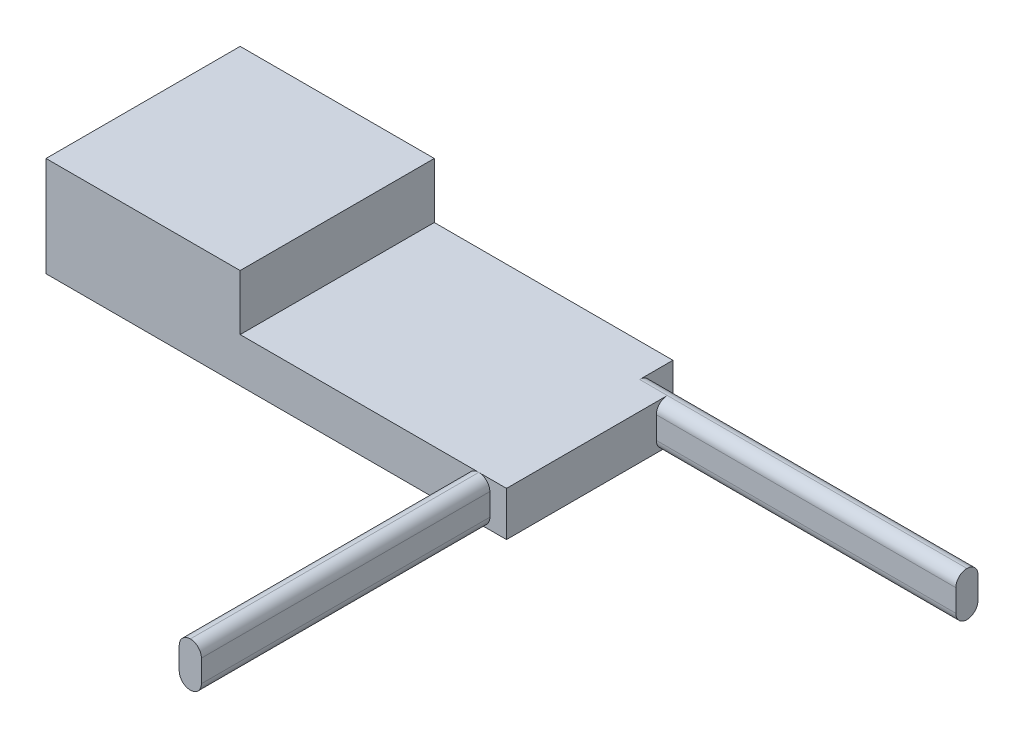
ISO-10303-21;
HEADER;
FILE_DESCRIPTION(('STEP AP214'),'2;1');
FILE_NAME('part.step','',(''),(''),'','','');
FILE_SCHEMA(('AUTOMOTIVE_DESIGN { 1 0 10303 214 1 1 1 1 }'));
ENDSEC;
DATA;
#1=APPLICATION_CONTEXT('core data for automotive mechanical design processes');
#2=APPLICATION_PROTOCOL_DEFINITION('international standard','automotive_design',2000,#1);
#3=PRODUCT_CONTEXT('',#1,'mechanical');
#4=PRODUCT('Part','Part','',(#3));
#5=PRODUCT_RELATED_PRODUCT_CATEGORY('part','',(#4));
#6=PRODUCT_DEFINITION_FORMATION('','',#4);
#7=PRODUCT_DEFINITION_CONTEXT('part definition',#1,'design');
#8=PRODUCT_DEFINITION('design','',#6,#7);
#9=PRODUCT_DEFINITION_SHAPE('','',#8);
#10=(LENGTH_UNIT() NAMED_UNIT(*) SI_UNIT(.MILLI.,.METRE.));
#11=(NAMED_UNIT(*) PLANE_ANGLE_UNIT() SI_UNIT($,.RADIAN.));
#12=(NAMED_UNIT(*) SI_UNIT($,.STERADIAN.) SOLID_ANGLE_UNIT());
#13=UNCERTAINTY_MEASURE_WITH_UNIT(LENGTH_MEASURE(1.E-05),#10,'distance_accuracy_value','');
#14=(GEOMETRIC_REPRESENTATION_CONTEXT(3) GLOBAL_UNCERTAINTY_ASSIGNED_CONTEXT((#13)) GLOBAL_UNIT_ASSIGNED_CONTEXT((#10,
#11,#12)) REPRESENTATION_CONTEXT('',''));
#15=CARTESIAN_POINT('',(0.,0.,0.));
#16=DIRECTION('',(0.,0.,1.));
#17=DIRECTION('',(1.,0.,0.));
#18=AXIS2_PLACEMENT_3D('',#15,#16,#17);
#19=CARTESIAN_POINT('',(0.,4.,0.));
#20=DIRECTION('',(0.,1.,0.));
#21=DIRECTION('',(0.,0.,1.));
#22=AXIS2_PLACEMENT_3D('',#19,#20,#21);
#23=PLANE('',#22);
#24=DIRECTION('',(-1.,0.,0.));
#25=VECTOR('',#24,1.);
#26=CARTESIAN_POINT('',(27.5,4.,-17.4999999999841));
#27=LINE('',#26,#25);
#28=CARTESIAN_POINT('',(27.5,4.,-17.4999999999841));
#29=VERTEX_POINT('',#28);
#30=CARTESIAN_POINT('',(5.99101541676987,4.,-17.4999999999841));
#31=VERTEX_POINT('',#30);
#32=EDGE_CURVE('E55',#29,#31,#27,.T.);
#33=ORIENTED_EDGE('',*,*,#32,.T.);
#34=DIRECTION('',(0.,0.,-1.));
#35=VECTOR('',#34,1.);
#36=CARTESIAN_POINT('',(5.99101541676987,4.,-17.4999999999841));
#37=LINE('',#36,#35);
#38=CARTESIAN_POINT('',(5.99101541676987,4.,0.));
#39=VERTEX_POINT('',#38);
#40=EDGE_CURVE('E50',#39,#31,#37,.T.);
#41=ORIENTED_EDGE('',*,*,#40,.F.);
#42=DIRECTION('',(1.,0.,0.));
#43=VECTOR('',#42,1.);
#44=CARTESIAN_POINT('',(-11.5089845832301,4.,0.));
#45=LINE('',#44,#43);
#46=CARTESIAN_POINT('',(27.5,4.,0.));
#47=VERTEX_POINT('',#46);
#48=EDGE_CURVE('E198',#39,#47,#45,.T.);
#49=ORIENTED_EDGE('',*,*,#48,.T.);
#50=DIRECTION('',(1.,0.,0.));
#51=VECTOR('',#50,1.);
#52=CARTESIAN_POINT('',(28.5,4.,0.));
#53=LINE('',#52,#51);
#54=CARTESIAN_POINT('',(30.,4.,0.));
#55=VERTEX_POINT('',#54);
#56=EDGE_CURVE('E200',#47,#55,#53,.T.);
#57=ORIENTED_EDGE('',*,*,#56,.T.);
#58=DIRECTION('',(0.,0.,-1.));
#59=VECTOR('',#58,1.);
#60=CARTESIAN_POINT('',(30.,4.,-13.5));
#61=LINE('',#60,#59);
#62=CARTESIAN_POINT('',(30.,4.,-14.5));
#63=VERTEX_POINT('',#62);
#64=EDGE_CURVE('E202',#55,#63,#61,.T.);
#65=ORIENTED_EDGE('',*,*,#64,.T.);
#66=DIRECTION('',(-1.,0.,0.));
#67=VECTOR('',#66,1.);
#68=CARTESIAN_POINT('',(27.5,4.,-14.5));
#69=LINE('',#68,#67);
#70=CARTESIAN_POINT('',(27.5,4.,-14.5));
#71=VERTEX_POINT('',#70);
#72=EDGE_CURVE('E289',#63,#71,#69,.T.);
#73=ORIENTED_EDGE('',*,*,#72,.T.);
#74=DIRECTION('',(0.,0.,-1.));
#75=VECTOR('',#74,1.);
#76=CARTESIAN_POINT('',(27.5,4.,-15.5));
#77=LINE('',#76,#75);
#78=EDGE_CURVE('E204',#71,#29,#77,.T.);
#79=ORIENTED_EDGE('',*,*,#78,.T.);
#80=EDGE_LOOP('',(#33,#41,#49,#57,#65,#73,#79));
#81=FACE_BOUND('',#80,.T.);
#82=ADVANCED_FACE('F33',(#81),#23,.T.);
#83=CARTESIAN_POINT('',(0.,4.,0.));
#84=DIRECTION('',(0.,0.,-1.));
#85=DIRECTION('',(-1.,0.,0.));
#86=AXIS2_PLACEMENT_3D('',#83,#84,#85);
#87=PLANE('',#86);
#88=DIRECTION('',(1.,0.,0.));
#89=VECTOR('',#88,1.);
#90=CARTESIAN_POINT('',(0.,0.,0.));
#91=LINE('',#90,#89);
#92=CARTESIAN_POINT('',(-11.5089845832301,0.,0.));
#93=VERTEX_POINT('',#92);
#94=CARTESIAN_POINT('',(27.5,0.,0.));
#95=VERTEX_POINT('',#94);
#96=EDGE_CURVE('E207',#93,#95,#91,.T.);
#97=ORIENTED_EDGE('',*,*,#96,.T.);
#98=CARTESIAN_POINT('',(27.5,1.,0.));
#99=DIRECTION('',(0.,0.,-1.));
#100=DIRECTION('',(-1.,0.,0.));
#101=AXIS2_PLACEMENT_3D('',#98,#99,#100);
#102=CIRCLE('',#101,1.);
#103=CARTESIAN_POINT('',(26.5,1.,0.));
#104=VERTEX_POINT('',#103);
#105=EDGE_CURVE('E298',#95,#104,#102,.T.);
#106=ORIENTED_EDGE('',*,*,#105,.T.);
#107=DIRECTION('',(0.,-1.,0.));
#108=VECTOR('',#107,1.);
#109=CARTESIAN_POINT('',(26.5,4.,0.));
#110=LINE('',#109,#108);
#111=CARTESIAN_POINT('',(26.5,3.,0.));
#112=VERTEX_POINT('',#111);
#113=EDGE_CURVE('E248',#112,#104,#110,.T.);
#114=ORIENTED_EDGE('',*,*,#113,.F.);
#115=CARTESIAN_POINT('',(27.5,3.,0.));
#116=DIRECTION('',(0.,0.,-1.));
#117=DIRECTION('',(-1.,0.,0.));
#118=AXIS2_PLACEMENT_3D('',#115,#116,#117);
#119=CIRCLE('',#118,1.);
#120=EDGE_CURVE('E11',#112,#47,#119,.T.);
#121=ORIENTED_EDGE('',*,*,#120,.T.);
#122=ORIENTED_EDGE('',*,*,#48,.F.);
#123=DIRECTION('',(0.,-1.,0.));
#124=VECTOR('',#123,1.);
#125=CARTESIAN_POINT('',(5.99101541676988,9.,0.));
#126=LINE('',#125,#124);
#127=CARTESIAN_POINT('',(5.99101541676988,9.,0.));
#128=VERTEX_POINT('',#127);
#129=EDGE_CURVE('E180',#128,#39,#126,.T.);
#130=ORIENTED_EDGE('',*,*,#129,.F.);
#131=DIRECTION('',(1.,0.,0.));
#132=VECTOR('',#131,1.);
#133=CARTESIAN_POINT('',(-11.5089845832301,9.,0.));
#134=LINE('',#133,#132);
#135=CARTESIAN_POINT('',(-11.5089845832301,9.,0.));
#136=VERTEX_POINT('',#135);
#137=EDGE_CURVE('E177',#136,#128,#134,.T.);
#138=ORIENTED_EDGE('',*,*,#137,.F.);
#139=DIRECTION('',(0.,-1.,0.));
#140=VECTOR('',#139,1.);
#141=CARTESIAN_POINT('',(-11.5089845832301,4.,0.));
#142=LINE('',#141,#140);
#143=EDGE_CURVE('E165',#136,#93,#142,.T.);
#144=ORIENTED_EDGE('',*,*,#143,.T.);
#145=EDGE_LOOP('',(#97,#106,#114,#121,#122,#130,#138,#144));
#146=FACE_BOUND('',#145,.T.);
#147=ADVANCED_FACE('F178',(#146),#87,.F.);
#148=CARTESIAN_POINT('',(26.5,4.,26.));
#149=DIRECTION('',(1.,0.,0.));
#150=DIRECTION('',(0.,0.,-1.));
#151=AXIS2_PLACEMENT_3D('',#148,#149,#150);
#152=PLANE('',#151);
#153=ORIENTED_EDGE('',*,*,#113,.T.);
#154=DIRECTION('',(0.,0.,1.));
#155=VECTOR('',#154,1.);
#156=CARTESIAN_POINT('',(26.5,1.,26.));
#157=LINE('',#156,#155);
#158=CARTESIAN_POINT('',(26.5,1.,26.));
#159=VERTEX_POINT('',#158);
#160=EDGE_CURVE('E283',#104,#159,#157,.T.);
#161=ORIENTED_EDGE('',*,*,#160,.T.);
#162=DIRECTION('',(0.,-1.,0.));
#163=VECTOR('',#162,1.);
#164=CARTESIAN_POINT('',(26.5,4.,26.));
#165=LINE('',#164,#163);
#166=CARTESIAN_POINT('',(26.5,3.,26.));
#167=VERTEX_POINT('',#166);
#168=EDGE_CURVE('E245',#167,#159,#165,.T.);
#169=ORIENTED_EDGE('',*,*,#168,.F.);
#170=DIRECTION('',(0.,0.,1.));
#171=VECTOR('',#170,1.);
#172=CARTESIAN_POINT('',(26.5,3.,0.));
#173=LINE('',#172,#171);
#174=EDGE_CURVE('E281',#167,#112,#173,.F.);
#175=ORIENTED_EDGE('',*,*,#174,.T.);
#176=EDGE_LOOP('',(#153,#161,#169,#175));
#177=FACE_BOUND('',#176,.T.);
#178=ADVANCED_FACE('F334',(#177),#152,.F.);
#179=CARTESIAN_POINT('',(26.5,4.,26.));
#180=DIRECTION('',(0.,0.,-1.));
#181=DIRECTION('',(-1.,0.,0.));
#182=AXIS2_PLACEMENT_3D('',#179,#180,#181);
#183=PLANE('',#182);
#184=CARTESIAN_POINT('',(27.5,1.,26.));
#185=DIRECTION('',(0.,0.,-1.));
#186=DIRECTION('',(-1.,0.,0.));
#187=AXIS2_PLACEMENT_3D('',#184,#185,#186);
#188=CIRCLE('',#187,1.);
#189=CARTESIAN_POINT('',(27.5,0.,26.));
#190=VERTEX_POINT('',#189);
#191=EDGE_CURVE('E277',#159,#190,#188,.F.);
#192=ORIENTED_EDGE('',*,*,#191,.T.);
#193=CARTESIAN_POINT('',(27.5,1.,26.));
#194=DIRECTION('',(0.,0.,-1.));
#195=DIRECTION('',(-1.,0.,0.));
#196=AXIS2_PLACEMENT_3D('',#193,#194,#195);
#197=CIRCLE('',#196,1.);
#198=CARTESIAN_POINT('',(28.5,1.,26.));
#199=VERTEX_POINT('',#198);
#200=EDGE_CURVE('E279',#190,#199,#197,.F.);
#201=ORIENTED_EDGE('',*,*,#200,.T.);
#202=DIRECTION('',(0.,-1.,0.));
#203=VECTOR('',#202,1.);
#204=CARTESIAN_POINT('',(28.5,4.,26.));
#205=LINE('',#204,#203);
#206=CARTESIAN_POINT('',(28.5,3.,26.));
#207=VERTEX_POINT('',#206);
#208=EDGE_CURVE('E242',#207,#199,#205,.T.);
#209=ORIENTED_EDGE('',*,*,#208,.F.);
#210=CARTESIAN_POINT('',(27.5,3.,26.));
#211=DIRECTION('',(0.,0.,-1.));
#212=DIRECTION('',(-1.,0.,0.));
#213=AXIS2_PLACEMENT_3D('',#210,#211,#212);
#214=CIRCLE('',#213,1.);
#215=CARTESIAN_POINT('',(27.5,4.,26.));
#216=VERTEX_POINT('',#215);
#217=EDGE_CURVE('E275',#207,#216,#214,.F.);
#218=ORIENTED_EDGE('',*,*,#217,.T.);
#219=CARTESIAN_POINT('',(27.5,3.,26.));
#220=DIRECTION('',(0.,0.,-1.));
#221=DIRECTION('',(-1.,0.,0.));
#222=AXIS2_PLACEMENT_3D('',#219,#220,#221);
#223=CIRCLE('',#222,1.);
#224=EDGE_CURVE('E273',#216,#167,#223,.F.);
#225=ORIENTED_EDGE('',*,*,#224,.T.);
#226=ORIENTED_EDGE('',*,*,#168,.T.);
#227=EDGE_LOOP('',(#192,#201,#209,#218,#225,#226));
#228=FACE_BOUND('',#227,.T.);
#229=ADVANCED_FACE('F330',(#228),#183,.F.);
#230=CARTESIAN_POINT('',(28.5,4.,0.));
#231=DIRECTION('',(-1.,0.,0.));
#232=DIRECTION('',(0.,0.,1.));
#233=AXIS2_PLACEMENT_3D('',#230,#231,#232);
#234=PLANE('',#233);
#235=ORIENTED_EDGE('',*,*,#208,.T.);
#236=DIRECTION('',(0.,0.,-1.));
#237=VECTOR('',#236,1.);
#238=CARTESIAN_POINT('',(28.5,1.,0.));
#239=LINE('',#238,#237);
#240=CARTESIAN_POINT('',(28.5,1.,0.));
#241=VERTEX_POINT('',#240);
#242=EDGE_CURVE('E270',#199,#241,#239,.T.);
#243=ORIENTED_EDGE('',*,*,#242,.T.);
#244=DIRECTION('',(0.,-1.,0.));
#245=VECTOR('',#244,1.);
#246=CARTESIAN_POINT('',(28.5,4.,0.));
#247=LINE('',#246,#245);
#248=CARTESIAN_POINT('',(28.5,3.,0.));
#249=VERTEX_POINT('',#248);
#250=EDGE_CURVE('E239',#249,#241,#247,.T.);
#251=ORIENTED_EDGE('',*,*,#250,.F.);
#252=DIRECTION('',(0.,0.,-1.));
#253=VECTOR('',#252,1.);
#254=CARTESIAN_POINT('',(28.5,3.,26.));
#255=LINE('',#254,#253);
#256=EDGE_CURVE('E267',#249,#207,#255,.F.);
#257=ORIENTED_EDGE('',*,*,#256,.T.);
#258=EDGE_LOOP('',(#235,#243,#251,#257));
#259=FACE_BOUND('',#258,.T.);
#260=ADVANCED_FACE('F345',(#259),#234,.F.);
#261=CARTESIAN_POINT('',(28.5,4.,0.));
#262=DIRECTION('',(0.,0.,-1.));
#263=DIRECTION('',(-1.,0.,0.));
#264=AXIS2_PLACEMENT_3D('',#261,#262,#263);
#265=PLANE('',#264);
#266=DIRECTION('',(1.,0.,0.));
#267=VECTOR('',#266,1.);
#268=CARTESIAN_POINT('',(28.5,0.,0.));
#269=LINE('',#268,#267);
#270=CARTESIAN_POINT('',(30.,0.,0.));
#271=VERTEX_POINT('',#270);
#272=EDGE_CURVE('E209',#95,#271,#269,.T.);
#273=ORIENTED_EDGE('',*,*,#272,.T.);
#274=DIRECTION('',(0.,-1.,0.));
#275=VECTOR('',#274,1.);
#276=CARTESIAN_POINT('',(30.,4.,0.));
#277=LINE('',#276,#275);
#278=EDGE_CURVE('E236',#55,#271,#277,.T.);
#279=ORIENTED_EDGE('',*,*,#278,.F.);
#280=ORIENTED_EDGE('',*,*,#56,.F.);
#281=CARTESIAN_POINT('',(27.5,3.,0.));
#282=DIRECTION('',(0.,0.,-1.));
#283=DIRECTION('',(-1.,0.,0.));
#284=AXIS2_PLACEMENT_3D('',#281,#282,#283);
#285=CIRCLE('',#284,1.);
#286=EDGE_CURVE('E42',#47,#249,#285,.T.);
#287=ORIENTED_EDGE('',*,*,#286,.T.);
#288=ORIENTED_EDGE('',*,*,#250,.T.);
#289=CARTESIAN_POINT('',(27.5,1.,0.));
#290=DIRECTION('',(0.,0.,-1.));
#291=DIRECTION('',(-1.,0.,0.));
#292=AXIS2_PLACEMENT_3D('',#289,#290,#291);
#293=CIRCLE('',#292,1.);
#294=EDGE_CURVE('E295',#241,#95,#293,.T.);
#295=ORIENTED_EDGE('',*,*,#294,.T.);
#296=EDGE_LOOP('',(#273,#279,#280,#287,#288,#295));
#297=FACE_BOUND('',#296,.T.);
#298=ADVANCED_FACE('F349',(#297),#265,.F.);
#299=CARTESIAN_POINT('',(30.,4.,-13.5));
#300=DIRECTION('',(-1.,0.,0.));
#301=DIRECTION('',(0.,0.,1.));
#302=AXIS2_PLACEMENT_3D('',#299,#300,#301);
#303=PLANE('',#302);
#304=DIRECTION('',(0.,0.,-1.));
#305=VECTOR('',#304,1.);
#306=CARTESIAN_POINT('',(30.,0.,-13.5));
#307=LINE('',#306,#305);
#308=CARTESIAN_POINT('',(30.,0.,-14.5));
#309=VERTEX_POINT('',#308);
#310=EDGE_CURVE('E212',#271,#309,#307,.T.);
#311=ORIENTED_EDGE('',*,*,#310,.T.);
#312=CARTESIAN_POINT('',(30.,1.,-14.5));
#313=DIRECTION('',(-1.,0.,0.));
#314=DIRECTION('',(0.,0.,1.));
#315=AXIS2_PLACEMENT_3D('',#312,#313,#314);
#316=CIRCLE('',#315,1.);
#317=CARTESIAN_POINT('',(30.,1.,-13.5));
#318=VERTEX_POINT('',#317);
#319=EDGE_CURVE('E300',#309,#318,#316,.T.);
#320=ORIENTED_EDGE('',*,*,#319,.T.);
#321=DIRECTION('',(0.,-1.,0.));
#322=VECTOR('',#321,1.);
#323=CARTESIAN_POINT('',(30.,4.,-13.5));
#324=LINE('',#323,#322);
#325=CARTESIAN_POINT('',(30.,3.,-13.5));
#326=VERTEX_POINT('',#325);
#327=EDGE_CURVE('E233',#326,#318,#324,.T.);
#328=ORIENTED_EDGE('',*,*,#327,.F.);
#329=CARTESIAN_POINT('',(30.,3.,-14.5));
#330=DIRECTION('',(-1.,0.,0.));
#331=DIRECTION('',(0.,0.,1.));
#332=AXIS2_PLACEMENT_3D('',#329,#330,#331);
#333=CIRCLE('',#332,1.);
#334=EDGE_CURVE('E304',#326,#63,#333,.T.);
#335=ORIENTED_EDGE('',*,*,#334,.T.);
#336=ORIENTED_EDGE('',*,*,#64,.F.);
#337=ORIENTED_EDGE('',*,*,#278,.T.);
#338=EDGE_LOOP('',(#311,#320,#328,#335,#336,#337));
#339=FACE_BOUND('',#338,.T.);
#340=ADVANCED_FACE('F360',(#339),#303,.F.);
#341=CARTESIAN_POINT('',(30.,4.,-13.5));
#342=DIRECTION('',(0.,0.,-1.));
#343=DIRECTION('',(-1.,0.,0.));
#344=AXIS2_PLACEMENT_3D('',#341,#342,#343);
#345=PLANE('',#344);
#346=ORIENTED_EDGE('',*,*,#327,.T.);
#347=DIRECTION('',(1.,0.,0.));
#348=VECTOR('',#347,1.);
#349=CARTESIAN_POINT('',(30.,1.,-13.5));
#350=LINE('',#349,#348);
#351=CARTESIAN_POINT('',(57.,1.,-13.5));
#352=VERTEX_POINT('',#351);
#353=EDGE_CURVE('E287',#318,#352,#350,.T.);
#354=ORIENTED_EDGE('',*,*,#353,.T.);
#355=DIRECTION('',(0.,-1.,0.));
#356=VECTOR('',#355,1.);
#357=CARTESIAN_POINT('',(57.,4.,-13.5));
#358=LINE('',#357,#356);
#359=CARTESIAN_POINT('',(57.,3.,-13.5));
#360=VERTEX_POINT('',#359);
#361=EDGE_CURVE('E230',#360,#352,#358,.T.);
#362=ORIENTED_EDGE('',*,*,#361,.F.);
#363=DIRECTION('',(1.,0.,0.));
#364=VECTOR('',#363,1.);
#365=CARTESIAN_POINT('',(30.,3.,-13.5));
#366=LINE('',#365,#364);
#367=EDGE_CURVE('E285',#360,#326,#366,.F.);
#368=ORIENTED_EDGE('',*,*,#367,.T.);
#369=EDGE_LOOP('',(#346,#354,#362,#368));
#370=FACE_BOUND('',#369,.T.);
#371=ADVANCED_FACE('F410',(#370),#345,.F.);
#372=CARTESIAN_POINT('',(57.,4.,-13.5));
#373=DIRECTION('',(-1.,0.,0.));
#374=DIRECTION('',(0.,0.,1.));
#375=AXIS2_PLACEMENT_3D('',#372,#373,#374);
#376=PLANE('',#375);
#377=CARTESIAN_POINT('',(57.,1.,-14.5));
#378=DIRECTION('',(-1.,0.,0.));
#379=DIRECTION('',(0.,0.,1.));
#380=AXIS2_PLACEMENT_3D('',#377,#378,#379);
#381=CIRCLE('',#380,1.);
#382=CARTESIAN_POINT('',(57.,0.,-14.5));
#383=VERTEX_POINT('',#382);
#384=EDGE_CURVE('E263',#352,#383,#381,.F.);
#385=ORIENTED_EDGE('',*,*,#384,.T.);
#386=CARTESIAN_POINT('',(57.,1.,-14.5));
#387=DIRECTION('',(-1.,0.,0.));
#388=DIRECTION('',(0.,0.,1.));
#389=AXIS2_PLACEMENT_3D('',#386,#387,#388);
#390=CIRCLE('',#389,1.);
#391=CARTESIAN_POINT('',(57.,1.,-15.5));
#392=VERTEX_POINT('',#391);
#393=EDGE_CURVE('E265',#383,#392,#390,.F.);
#394=ORIENTED_EDGE('',*,*,#393,.T.);
#395=DIRECTION('',(0.,-1.,0.));
#396=VECTOR('',#395,1.);
#397=CARTESIAN_POINT('',(57.,4.,-15.5));
#398=LINE('',#397,#396);
#399=CARTESIAN_POINT('',(57.,3.,-15.5));
#400=VERTEX_POINT('',#399);
#401=EDGE_CURVE('E227',#400,#392,#398,.T.);
#402=ORIENTED_EDGE('',*,*,#401,.F.);
#403=CARTESIAN_POINT('',(57.,3.,-14.5));
#404=DIRECTION('',(-1.,0.,0.));
#405=DIRECTION('',(0.,0.,1.));
#406=AXIS2_PLACEMENT_3D('',#403,#404,#405);
#407=CIRCLE('',#406,1.);
#408=CARTESIAN_POINT('',(57.,4.,-14.5));
#409=VERTEX_POINT('',#408);
#410=EDGE_CURVE('E261',#400,#409,#407,.F.);
#411=ORIENTED_EDGE('',*,*,#410,.T.);
#412=CARTESIAN_POINT('',(57.,3.,-14.5));
#413=DIRECTION('',(-1.,0.,0.));
#414=DIRECTION('',(0.,0.,1.));
#415=AXIS2_PLACEMENT_3D('',#412,#413,#414);
#416=CIRCLE('',#415,1.);
#417=EDGE_CURVE('E259',#409,#360,#416,.F.);
#418=ORIENTED_EDGE('',*,*,#417,.T.);
#419=ORIENTED_EDGE('',*,*,#361,.T.);
#420=EDGE_LOOP('',(#385,#394,#402,#411,#418,#419));
#421=FACE_BOUND('',#420,.T.);
#422=ADVANCED_FACE('F407',(#421),#376,.F.);
#423=CARTESIAN_POINT('',(29.,4.,-15.5));
#424=DIRECTION('',(0.,0.,1.));
#425=DIRECTION('',(1.,0.,0.));
#426=AXIS2_PLACEMENT_3D('',#423,#424,#425);
#427=PLANE('',#426);
#428=ORIENTED_EDGE('',*,*,#401,.T.);
#429=DIRECTION('',(-1.,0.,0.));
#430=VECTOR('',#429,1.);
#431=CARTESIAN_POINT('',(29.,1.,-15.5));
#432=LINE('',#431,#430);
#433=CARTESIAN_POINT('',(27.5,1.,-15.5));
#434=VERTEX_POINT('',#433);
#435=EDGE_CURVE('E253',#392,#434,#432,.T.);
#436=ORIENTED_EDGE('',*,*,#435,.T.);
#437=DIRECTION('',(0.,-1.,0.));
#438=VECTOR('',#437,1.);
#439=CARTESIAN_POINT('',(27.5,4.,-15.5));
#440=LINE('',#439,#438);
#441=CARTESIAN_POINT('',(27.5,3.,-15.5));
#442=VERTEX_POINT('',#441);
#443=EDGE_CURVE('E224',#442,#434,#440,.T.);
#444=ORIENTED_EDGE('',*,*,#443,.F.);
#445=DIRECTION('',(-1.,0.,0.));
#446=VECTOR('',#445,1.);
#447=CARTESIAN_POINT('',(57.,3.,-15.5));
#448=LINE('',#447,#446);
#449=EDGE_CURVE('E251',#442,#400,#448,.F.);
#450=ORIENTED_EDGE('',*,*,#449,.T.);
#451=EDGE_LOOP('',(#428,#436,#444,#450));
#452=FACE_BOUND('',#451,.T.);
#453=ADVANCED_FACE('F371',(#452),#427,.F.);
#454=CARTESIAN_POINT('',(27.5,4.,-15.5));
#455=DIRECTION('',(-1.,0.,0.));
#456=DIRECTION('',(0.,0.,1.));
#457=AXIS2_PLACEMENT_3D('',#454,#455,#456);
#458=PLANE('',#457);
#459=DIRECTION('',(0.,0.,-1.));
#460=VECTOR('',#459,1.);
#461=CARTESIAN_POINT('',(27.5,0.,-15.5));
#462=LINE('',#461,#460);
#463=CARTESIAN_POINT('',(27.5,0.,-14.5));
#464=VERTEX_POINT('',#463);
#465=CARTESIAN_POINT('',(27.5,0.,-17.4999999999841));
#466=VERTEX_POINT('',#465);
#467=EDGE_CURVE('E214',#464,#466,#462,.T.);
#468=ORIENTED_EDGE('',*,*,#467,.T.);
#469=DIRECTION('',(0.,-1.,0.));
#470=VECTOR('',#469,1.);
#471=CARTESIAN_POINT('',(27.5,4.,-17.4999999999841));
#472=LINE('',#471,#470);
#473=EDGE_CURVE('E221',#29,#466,#472,.T.);
#474=ORIENTED_EDGE('',*,*,#473,.F.);
#475=ORIENTED_EDGE('',*,*,#78,.F.);
#476=CARTESIAN_POINT('',(27.5,3.,-14.5));
#477=DIRECTION('',(-1.,0.,0.));
#478=DIRECTION('',(0.,0.,1.));
#479=AXIS2_PLACEMENT_3D('',#476,#477,#478);
#480=CIRCLE('',#479,1.);
#481=EDGE_CURVE('E302',#71,#442,#480,.T.);
#482=ORIENTED_EDGE('',*,*,#481,.T.);
#483=ORIENTED_EDGE('',*,*,#443,.T.);
#484=CARTESIAN_POINT('',(27.5,1.,-14.5));
#485=DIRECTION('',(-1.,0.,0.));
#486=DIRECTION('',(0.,0.,1.));
#487=AXIS2_PLACEMENT_3D('',#484,#485,#486);
#488=CIRCLE('',#487,1.);
#489=EDGE_CURVE('E292',#434,#464,#488,.T.);
#490=ORIENTED_EDGE('',*,*,#489,.T.);
#491=EDGE_LOOP('',(#468,#474,#475,#482,#483,#490));
#492=FACE_BOUND('',#491,.T.);
#493=ADVANCED_FACE('F369',(#492),#458,.F.);
#494=CARTESIAN_POINT('',(-11.5089845832301,4.,-17.4999999999841));
#495=DIRECTION('',(0.,0.,1.));
#496=DIRECTION('',(1.,0.,0.));
#497=AXIS2_PLACEMENT_3D('',#494,#495,#496);
#498=PLANE('',#497);
#499=DIRECTION('',(-1.,0.,0.));
#500=VECTOR('',#499,1.);
#501=CARTESIAN_POINT('',(-11.5089845832301,0.,-17.4999999999841));
#502=LINE('',#501,#500);
#503=CARTESIAN_POINT('',(-11.5089845832301,0.,-17.4999999999841));
#504=VERTEX_POINT('',#503);
#505=EDGE_CURVE('E217',#466,#504,#502,.T.);
#506=ORIENTED_EDGE('',*,*,#505,.T.);
#507=DIRECTION('',(0.,-1.,0.));
#508=VECTOR('',#507,1.);
#509=CARTESIAN_POINT('',(-11.5089845832301,4.,-17.4999999999841));
#510=LINE('',#509,#508);
#511=CARTESIAN_POINT('',(-11.5089845832301,9.,-17.4999999999841));
#512=VERTEX_POINT('',#511);
#513=EDGE_CURVE('E174',#512,#504,#510,.T.);
#514=ORIENTED_EDGE('',*,*,#513,.F.);
#515=DIRECTION('',(-1.,0.,0.));
#516=VECTOR('',#515,1.);
#517=CARTESIAN_POINT('',(-11.5089845832301,9.,-17.4999999999841));
#518=LINE('',#517,#516);
#519=CARTESIAN_POINT('',(5.99101541676987,9.,-17.4999999999841));
#520=VERTEX_POINT('',#519);
#521=EDGE_CURVE('E188',#520,#512,#518,.T.);
#522=ORIENTED_EDGE('',*,*,#521,.F.);
#523=DIRECTION('',(0.,-1.,0.));
#524=VECTOR('',#523,1.);
#525=CARTESIAN_POINT('',(5.99101541676987,9.,-17.4999999999841));
#526=LINE('',#525,#524);
#527=EDGE_CURVE('E193',#520,#31,#526,.T.);
#528=ORIENTED_EDGE('',*,*,#527,.T.);
#529=ORIENTED_EDGE('',*,*,#32,.F.);
#530=ORIENTED_EDGE('',*,*,#473,.T.);
#531=EDGE_LOOP('',(#506,#514,#522,#528,#529,#530));
#532=FACE_BOUND('',#531,.T.);
#533=ADVANCED_FACE('F378',(#532),#498,.F.);
#534=CARTESIAN_POINT('',(-11.5089845832301,4.,-17.4999999999841));
#535=DIRECTION('',(1.,0.,0.));
#536=DIRECTION('',(0.,0.,-1.));
#537=AXIS2_PLACEMENT_3D('',#534,#535,#536);
#538=PLANE('',#537);
#539=DIRECTION('',(0.,0.,1.));
#540=VECTOR('',#539,1.);
#541=CARTESIAN_POINT('',(-11.5089845832301,0.,-17.4999999999841));
#542=LINE('',#541,#540);
#543=EDGE_CURVE('E172',#504,#93,#542,.T.);
#544=ORIENTED_EDGE('',*,*,#543,.T.);
#545=ORIENTED_EDGE('',*,*,#143,.F.);
#546=DIRECTION('',(0.,0.,1.));
#547=VECTOR('',#546,1.);
#548=CARTESIAN_POINT('',(-11.5089845832301,9.,-17.4999999999841));
#549=LINE('',#548,#547);
#550=EDGE_CURVE('E170',#512,#136,#549,.T.);
#551=ORIENTED_EDGE('',*,*,#550,.F.);
#552=ORIENTED_EDGE('',*,*,#513,.T.);
#553=EDGE_LOOP('',(#544,#545,#551,#552));
#554=FACE_BOUND('',#553,.T.);
#555=ADVANCED_FACE('F167',(#554),#538,.F.);
#556=CARTESIAN_POINT('',(0.,0.,0.));
#557=DIRECTION('',(0.,1.,0.));
#558=DIRECTION('',(0.,0.,1.));
#559=AXIS2_PLACEMENT_3D('',#556,#557,#558);
#560=PLANE('',#559);
#561=ORIENTED_EDGE('',*,*,#272,.F.);
#562=ORIENTED_EDGE('',*,*,#96,.F.);
#563=ORIENTED_EDGE('',*,*,#543,.F.);
#564=ORIENTED_EDGE('',*,*,#505,.F.);
#565=ORIENTED_EDGE('',*,*,#467,.F.);
#566=DIRECTION('',(-1.,0.,0.));
#567=VECTOR('',#566,1.);
#568=CARTESIAN_POINT('',(0.,0.,-14.5));
#569=LINE('',#568,#567);
#570=EDGE_CURVE('E256',#464,#309,#569,.F.);
#571=ORIENTED_EDGE('',*,*,#570,.T.);
#572=ORIENTED_EDGE('',*,*,#310,.F.);
#573=EDGE_LOOP('',(#561,#562,#563,#564,#565,#571,#572));
#574=FACE_BOUND('',#573,.T.);
#575=ADVANCED_FACE('F356',(#574),#560,.F.);
#576=CARTESIAN_POINT('',(30.,1.,-14.5));
#577=DIRECTION('',(1.,0.,0.));
#578=DIRECTION('',(0.,0.,-1.));
#579=AXIS2_PLACEMENT_3D('',#576,#577,#578);
#580=CYLINDRICAL_SURFACE('',#579,1.);
#581=ORIENTED_EDGE('',*,*,#353,.F.);
#582=ORIENTED_EDGE('',*,*,#319,.F.);
#583=DIRECTION('',(1.,0.,0.));
#584=VECTOR('',#583,1.);
#585=CARTESIAN_POINT('',(0.,0.,-14.5));
#586=LINE('',#585,#584);
#587=EDGE_CURVE('E210',#383,#309,#586,.F.);
#588=ORIENTED_EDGE('',*,*,#587,.F.);
#589=ORIENTED_EDGE('',*,*,#384,.F.);
#590=EDGE_LOOP('',(#581,#582,#588,#589));
#591=FACE_BOUND('',#590,.T.);
#592=ADVANCED_FACE('F398',(#591),#580,.T.);
#593=CARTESIAN_POINT('',(29.,1.,-14.5));
#594=DIRECTION('',(-1.,0.,0.));
#595=DIRECTION('',(0.,0.,1.));
#596=AXIS2_PLACEMENT_3D('',#593,#594,#595);
#597=CYLINDRICAL_SURFACE('',#596,1.);
#598=ORIENTED_EDGE('',*,*,#587,.T.);
#599=ORIENTED_EDGE('',*,*,#570,.F.);
#600=ORIENTED_EDGE('',*,*,#489,.F.);
#601=ORIENTED_EDGE('',*,*,#435,.F.);
#602=ORIENTED_EDGE('',*,*,#393,.F.);
#603=EDGE_LOOP('',(#598,#599,#600,#601,#602));
#604=FACE_BOUND('',#603,.T.);
#605=ADVANCED_FACE('F376',(#604),#597,.T.);
#606=CARTESIAN_POINT('',(27.5,1.,26.));
#607=DIRECTION('',(0.,0.,1.));
#608=DIRECTION('',(1.,0.,0.));
#609=AXIS2_PLACEMENT_3D('',#606,#607,#608);
#610=CYLINDRICAL_SURFACE('',#609,1.);
#611=DIRECTION('',(0.,0.,1.));
#612=VECTOR('',#611,1.);
#613=CARTESIAN_POINT('',(27.5,0.,0.));
#614=LINE('',#613,#612);
#615=EDGE_CURVE('E310',#190,#95,#614,.F.);
#616=ORIENTED_EDGE('',*,*,#615,.F.);
#617=ORIENTED_EDGE('',*,*,#191,.F.);
#618=ORIENTED_EDGE('',*,*,#160,.F.);
#619=ORIENTED_EDGE('',*,*,#105,.F.);
#620=EDGE_LOOP('',(#616,#617,#618,#619));
#621=FACE_BOUND('',#620,.T.);
#622=ADVANCED_FACE('F340',(#621),#610,.T.);
#623=CARTESIAN_POINT('',(27.5,1.,0.));
#624=DIRECTION('',(0.,0.,-1.));
#625=DIRECTION('',(-1.,0.,0.));
#626=AXIS2_PLACEMENT_3D('',#623,#624,#625);
#627=CYLINDRICAL_SURFACE('',#626,1.);
#628=ORIENTED_EDGE('',*,*,#200,.F.);
#629=ORIENTED_EDGE('',*,*,#615,.T.);
#630=ORIENTED_EDGE('',*,*,#294,.F.);
#631=ORIENTED_EDGE('',*,*,#242,.F.);
#632=EDGE_LOOP('',(#628,#629,#630,#631));
#633=FACE_BOUND('',#632,.T.);
#634=ADVANCED_FACE('F347',(#633),#627,.T.);
#635=CARTESIAN_POINT('',(0.,3.,-14.5));
#636=DIRECTION('',(-1.,0.,0.));
#637=DIRECTION('',(0.,0.,1.));
#638=AXIS2_PLACEMENT_3D('',#635,#636,#637);
#639=CYLINDRICAL_SURFACE('',#638,1.);
#640=ORIENTED_EDGE('',*,*,#367,.F.);
#641=ORIENTED_EDGE('',*,*,#417,.F.);
#642=DIRECTION('',(1.,0.,0.));
#643=VECTOR('',#642,1.);
#644=CARTESIAN_POINT('',(57.,4.,-14.5));
#645=LINE('',#644,#643);
#646=EDGE_CURVE('E312',#63,#409,#645,.T.);
#647=ORIENTED_EDGE('',*,*,#646,.F.);
#648=ORIENTED_EDGE('',*,*,#334,.F.);
#649=EDGE_LOOP('',(#640,#641,#647,#648));
#650=FACE_BOUND('',#649,.T.);
#651=ADVANCED_FACE('F432',(#650),#639,.T.);
#652=CARTESIAN_POINT('',(0.,3.,-14.5));
#653=DIRECTION('',(1.,0.,0.));
#654=DIRECTION('',(0.,0.,-1.));
#655=AXIS2_PLACEMENT_3D('',#652,#653,#654);
#656=CYLINDRICAL_SURFACE('',#655,1.);
#657=ORIENTED_EDGE('',*,*,#410,.F.);
#658=ORIENTED_EDGE('',*,*,#449,.F.);
#659=ORIENTED_EDGE('',*,*,#481,.F.);
#660=ORIENTED_EDGE('',*,*,#72,.F.);
#661=ORIENTED_EDGE('',*,*,#646,.T.);
#662=EDGE_LOOP('',(#657,#658,#659,#660,#661));
#663=FACE_BOUND('',#662,.T.);
#664=ADVANCED_FACE('F365',(#663),#656,.T.);
#665=CARTESIAN_POINT('',(27.5,3.,0.));
#666=DIRECTION('',(0.,0.,-1.));
#667=DIRECTION('',(-1.,0.,0.));
#668=AXIS2_PLACEMENT_3D('',#665,#666,#667);
#669=CYLINDRICAL_SURFACE('',#668,1.);
#670=ORIENTED_EDGE('',*,*,#174,.F.);
#671=ORIENTED_EDGE('',*,*,#224,.F.);
#672=DIRECTION('',(0.,0.,1.));
#673=VECTOR('',#672,1.);
#674=CARTESIAN_POINT('',(27.5,4.,26.));
#675=LINE('',#674,#673);
#676=EDGE_CURVE('E37',#47,#216,#675,.T.);
#677=ORIENTED_EDGE('',*,*,#676,.F.);
#678=ORIENTED_EDGE('',*,*,#120,.F.);
#679=EDGE_LOOP('',(#670,#671,#677,#678));
#680=FACE_BOUND('',#679,.T.);
#681=ADVANCED_FACE('F35',(#680),#669,.T.);
#682=CARTESIAN_POINT('',(27.5,3.,0.));
#683=DIRECTION('',(0.,0.,1.));
#684=DIRECTION('',(1.,0.,0.));
#685=AXIS2_PLACEMENT_3D('',#682,#683,#684);
#686=CYLINDRICAL_SURFACE('',#685,1.);
#687=ORIENTED_EDGE('',*,*,#217,.F.);
#688=ORIENTED_EDGE('',*,*,#256,.F.);
#689=ORIENTED_EDGE('',*,*,#286,.F.);
#690=ORIENTED_EDGE('',*,*,#676,.T.);
#691=EDGE_LOOP('',(#687,#688,#689,#690));
#692=FACE_BOUND('',#691,.T.);
#693=ADVANCED_FACE('F322',(#692),#686,.T.);
#694=CARTESIAN_POINT('',(5.99101541676987,9.,-17.4999999999841));
#695=DIRECTION('',(-1.,0.,0.));
#696=DIRECTION('',(0.,0.,1.));
#697=AXIS2_PLACEMENT_3D('',#694,#695,#696);
#698=PLANE('',#697);
#699=ORIENTED_EDGE('',*,*,#40,.T.);
#700=ORIENTED_EDGE('',*,*,#527,.F.);
#701=DIRECTION('',(0.,0.,-1.));
#702=VECTOR('',#701,1.);
#703=CARTESIAN_POINT('',(5.99101541676987,9.,-17.4999999999841));
#704=LINE('',#703,#702);
#705=EDGE_CURVE('E183',#128,#520,#704,.T.);
#706=ORIENTED_EDGE('',*,*,#705,.F.);
#707=ORIENTED_EDGE('',*,*,#129,.T.);
#708=EDGE_LOOP('',(#699,#700,#706,#707));
#709=FACE_BOUND('',#708,.T.);
#710=ADVANCED_FACE('F381',(#709),#698,.F.);
#711=CARTESIAN_POINT('',(0.,9.,0.));
#712=DIRECTION('',(0.,1.,0.));
#713=DIRECTION('',(0.,0.,1.));
#714=AXIS2_PLACEMENT_3D('',#711,#712,#713);
#715=PLANE('',#714);
#716=ORIENTED_EDGE('',*,*,#550,.T.);
#717=ORIENTED_EDGE('',*,*,#137,.T.);
#718=ORIENTED_EDGE('',*,*,#705,.T.);
#719=ORIENTED_EDGE('',*,*,#521,.T.);
#720=EDGE_LOOP('',(#716,#717,#718,#719));
#721=FACE_BOUND('',#720,.T.);
#722=ADVANCED_FACE('F186',(#721),#715,.T.);
#723=CLOSED_SHELL('',(#82,#147,#178,#229,#260,#298,#340,#371,#422,#453,#493,#533,#555,#575,#592,
#605,#622,#634,#651,#664,#681,#693,#710,#722));
#724=MANIFOLD_SOLID_BREP('B2',#723);
#725=ADVANCED_BREP_SHAPE_REPRESENTATION('',(#18,#724),#14);
#726=SHAPE_DEFINITION_REPRESENTATION(#9,#725);
ENDSEC;
END-ISO-10303-21;
